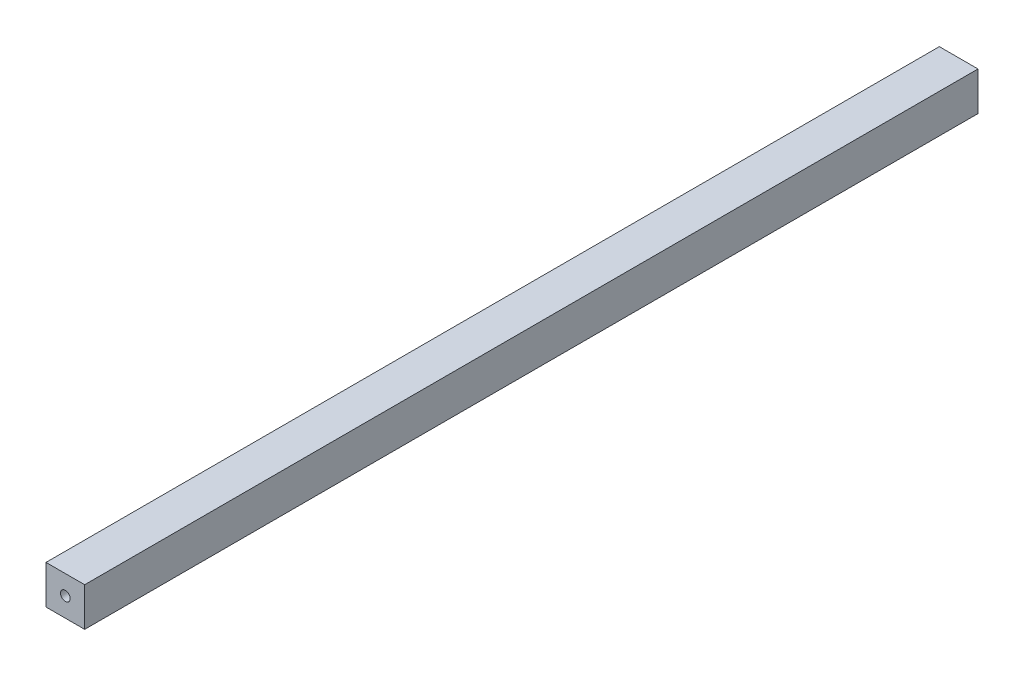
ISO-10303-21;
HEADER;
FILE_DESCRIPTION(('STEP AP214'),'2;1');
FILE_NAME('part.step','',(''),(''),'','','');
FILE_SCHEMA(('AUTOMOTIVE_DESIGN { 1 0 10303 214 1 1 1 1 }'));
ENDSEC;
DATA;
#1=APPLICATION_CONTEXT('core data for automotive mechanical design processes');
#2=APPLICATION_PROTOCOL_DEFINITION('international standard','automotive_design',2000,#1);
#3=PRODUCT_CONTEXT('',#1,'mechanical');
#4=PRODUCT('Part','Part','',(#3));
#5=PRODUCT_RELATED_PRODUCT_CATEGORY('part','',(#4));
#6=PRODUCT_DEFINITION_FORMATION('','',#4);
#7=PRODUCT_DEFINITION_CONTEXT('part definition',#1,'design');
#8=PRODUCT_DEFINITION('design','',#6,#7);
#9=PRODUCT_DEFINITION_SHAPE('','',#8);
#10=(LENGTH_UNIT() NAMED_UNIT(*) SI_UNIT(.MILLI.,.METRE.));
#11=(NAMED_UNIT(*) PLANE_ANGLE_UNIT() SI_UNIT($,.RADIAN.));
#12=(NAMED_UNIT(*) SI_UNIT($,.STERADIAN.) SOLID_ANGLE_UNIT());
#13=UNCERTAINTY_MEASURE_WITH_UNIT(LENGTH_MEASURE(1.E-05),#10,'distance_accuracy_value','');
#14=(GEOMETRIC_REPRESENTATION_CONTEXT(3) GLOBAL_UNCERTAINTY_ASSIGNED_CONTEXT((#13)) GLOBAL_UNIT_ASSIGNED_CONTEXT((#10,
#11,#12)) REPRESENTATION_CONTEXT('',''));
#15=CARTESIAN_POINT('',(0.,0.,0.));
#16=DIRECTION('',(0.,0.,1.));
#17=DIRECTION('',(1.,0.,0.));
#18=AXIS2_PLACEMENT_3D('',#15,#16,#17);
#19=CARTESIAN_POINT('',(-5.,5.,131.642135623731));
#20=DIRECTION('',(0.,-1.,0.));
#21=DIRECTION('',(0.,0.,-1.));
#22=AXIS2_PLACEMENT_3D('',#19,#20,#21);
#23=PLANE('',#22);
#24=DIRECTION('',(0.,0.,-1.));
#25=VECTOR('',#24,1.);
#26=CARTESIAN_POINT('',(-5.,5.,131.642135623731));
#27=LINE('',#26,#25);
#28=CARTESIAN_POINT('',(-5.,5.,115.5));
#29=VERTEX_POINT('',#28);
#30=CARTESIAN_POINT('',(-5.,5.,-115.5));
#31=VERTEX_POINT('',#30);
#32=EDGE_CURVE('E102',#29,#31,#27,.T.);
#33=ORIENTED_EDGE('',*,*,#32,.F.);
#34=DIRECTION('',(1.,0.,0.));
#35=VECTOR('',#34,1.);
#36=CARTESIAN_POINT('',(-5.,5.,115.5));
#37=LINE('',#36,#35);
#38=CARTESIAN_POINT('',(5.,5.,115.5));
#39=VERTEX_POINT('',#38);
#40=EDGE_CURVE('E43',#29,#39,#37,.T.);
#41=ORIENTED_EDGE('',*,*,#40,.T.);
#42=DIRECTION('',(0.,0.,-1.));
#43=VECTOR('',#42,1.);
#44=CARTESIAN_POINT('',(5.,5.,131.642135623731));
#45=LINE('',#44,#43);
#46=CARTESIAN_POINT('',(5.,5.,-115.5));
#47=VERTEX_POINT('',#46);
#48=EDGE_CURVE('E87',#39,#47,#45,.T.);
#49=ORIENTED_EDGE('',*,*,#48,.T.);
#50=DIRECTION('',(1.,0.,0.));
#51=VECTOR('',#50,1.);
#52=CARTESIAN_POINT('',(-5.,5.,-115.5));
#53=LINE('',#52,#51);
#54=EDGE_CURVE('E97',#31,#47,#53,.T.);
#55=ORIENTED_EDGE('',*,*,#54,.F.);
#56=EDGE_LOOP('',(#33,#41,#49,#55));
#57=FACE_BOUND('',#56,.T.);
#58=ADVANCED_FACE('F39',(#57),#23,.F.);
#59=CARTESIAN_POINT('',(5.,5.,131.642135623731));
#60=DIRECTION('',(-1.,0.,0.));
#61=DIRECTION('',(0.,-1.,0.));
#62=AXIS2_PLACEMENT_3D('',#59,#60,#61);
#63=PLANE('',#62);
#64=ORIENTED_EDGE('',*,*,#48,.F.);
#65=DIRECTION('',(0.,-1.,0.));
#66=VECTOR('',#65,1.);
#67=CARTESIAN_POINT('',(5.,5.,115.5));
#68=LINE('',#67,#66);
#69=CARTESIAN_POINT('',(5.,-5.,115.5));
#70=VERTEX_POINT('',#69);
#71=EDGE_CURVE('E83',#39,#70,#68,.T.);
#72=ORIENTED_EDGE('',*,*,#71,.T.);
#73=DIRECTION('',(0.,0.,-1.));
#74=VECTOR('',#73,1.);
#75=CARTESIAN_POINT('',(5.,-5.,131.642135623731));
#76=LINE('',#75,#74);
#77=CARTESIAN_POINT('',(5.,-5.,-115.5));
#78=VERTEX_POINT('',#77);
#79=EDGE_CURVE('E78',#70,#78,#76,.T.);
#80=ORIENTED_EDGE('',*,*,#79,.T.);
#81=DIRECTION('',(0.,-1.,0.));
#82=VECTOR('',#81,1.);
#83=CARTESIAN_POINT('',(5.,4.99999999999999,-115.5));
#84=LINE('',#83,#82);
#85=EDGE_CURVE('E82',#47,#78,#84,.T.);
#86=ORIENTED_EDGE('',*,*,#85,.F.);
#87=EDGE_LOOP('',(#64,#72,#80,#86));
#88=FACE_BOUND('',#87,.T.);
#89=ADVANCED_FACE('F81',(#88),#63,.F.);
#90=CARTESIAN_POINT('',(-5.,-5.,131.642135623731));
#91=DIRECTION('',(0.,1.,0.));
#92=DIRECTION('',(0.,0.,1.));
#93=AXIS2_PLACEMENT_3D('',#90,#91,#92);
#94=PLANE('',#93);
#95=ORIENTED_EDGE('',*,*,#79,.F.);
#96=DIRECTION('',(-1.,0.,0.));
#97=VECTOR('',#96,1.);
#98=CARTESIAN_POINT('',(-5.,-5.,115.5));
#99=LINE('',#98,#97);
#100=CARTESIAN_POINT('',(-5.,-5.,115.5));
#101=VERTEX_POINT('',#100);
#102=EDGE_CURVE('E48',#70,#101,#99,.T.);
#103=ORIENTED_EDGE('',*,*,#102,.T.);
#104=DIRECTION('',(0.,0.,-1.));
#105=VECTOR('',#104,1.);
#106=CARTESIAN_POINT('',(-5.,-5.,131.642135623731));
#107=LINE('',#106,#105);
#108=CARTESIAN_POINT('',(-5.,-5.,-115.5));
#109=VERTEX_POINT('',#108);
#110=EDGE_CURVE('E86',#101,#109,#107,.T.);
#111=ORIENTED_EDGE('',*,*,#110,.T.);
#112=DIRECTION('',(-1.,0.,0.));
#113=VECTOR('',#112,1.);
#114=CARTESIAN_POINT('',(-5.,-5.,-115.5));
#115=LINE('',#114,#113);
#116=EDGE_CURVE('E94',#78,#109,#115,.T.);
#117=ORIENTED_EDGE('',*,*,#116,.F.);
#118=EDGE_LOOP('',(#95,#103,#111,#117));
#119=FACE_BOUND('',#118,.T.);
#120=ADVANCED_FACE('F100',(#119),#94,.F.);
#121=CARTESIAN_POINT('',(-5.,5.,131.642135623731));
#122=DIRECTION('',(1.,0.,0.));
#123=DIRECTION('',(0.,1.,0.));
#124=AXIS2_PLACEMENT_3D('',#121,#122,#123);
#125=PLANE('',#124);
#126=ORIENTED_EDGE('',*,*,#110,.F.);
#127=DIRECTION('',(0.,1.,0.));
#128=VECTOR('',#127,1.);
#129=CARTESIAN_POINT('',(-5.,5.,115.5));
#130=LINE('',#129,#128);
#131=EDGE_CURVE('E12',#101,#29,#130,.T.);
#132=ORIENTED_EDGE('',*,*,#131,.T.);
#133=ORIENTED_EDGE('',*,*,#32,.T.);
#134=DIRECTION('',(0.,1.,0.));
#135=VECTOR('',#134,1.);
#136=CARTESIAN_POINT('',(-5.,4.99999999999999,-115.5));
#137=LINE('',#136,#135);
#138=EDGE_CURVE('E103',#109,#31,#137,.T.);
#139=ORIENTED_EDGE('',*,*,#138,.F.);
#140=EDGE_LOOP('',(#126,#132,#133,#139));
#141=FACE_BOUND('',#140,.T.);
#142=ADVANCED_FACE('F41',(#141),#125,.F.);
#143=CARTESIAN_POINT('',(-186.2,5.,115.5));
#144=DIRECTION('',(0.,0.,-1.));
#145=DIRECTION('',(0.,1.,0.));
#146=AXIS2_PLACEMENT_3D('',#143,#144,#145);
#147=PLANE('',#146);
#148=CARTESIAN_POINT('',(0.,0.,115.5));
#149=DIRECTION('',(0.,0.,1.));
#150=DIRECTION('',(1.,0.,0.));
#151=AXIS2_PLACEMENT_3D('',#148,#149,#150);
#152=CIRCLE('',#151,1.24999999999999);
#153=CARTESIAN_POINT('',(1.24999999999999,0.,115.5));
#154=VERTEX_POINT('',#153);
#155=EDGE_CURVE('E208',#154,#154,#152,.T.);
#156=ORIENTED_EDGE('',*,*,#155,.F.);
#157=EDGE_LOOP('',(#156));
#158=FACE_BOUND('',#157,.T.);
#159=ORIENTED_EDGE('',*,*,#102,.F.);
#160=ORIENTED_EDGE('',*,*,#71,.F.);
#161=ORIENTED_EDGE('',*,*,#40,.F.);
#162=ORIENTED_EDGE('',*,*,#131,.F.);
#163=EDGE_LOOP('',(#159,#160,#161,#162));
#164=FACE_BOUND('',#163,.T.);
#165=ADVANCED_FACE('F114',(#158,#164),#147,.F.);
#166=CARTESIAN_POINT('',(-186.2,-5.,-115.5));
#167=DIRECTION('',(0.,0.,1.));
#168=DIRECTION('',(0.,-1.,0.));
#169=AXIS2_PLACEMENT_3D('',#166,#167,#168);
#170=PLANE('',#169);
#171=CARTESIAN_POINT('',(0.,0.,-115.5));
#172=DIRECTION('',(0.,0.,-1.));
#173=DIRECTION('',(0.,1.,0.));
#174=AXIS2_PLACEMENT_3D('',#171,#172,#173);
#175=CIRCLE('',#174,1.24999999999999);
#176=CARTESIAN_POINT('',(0.,1.25000000000003,-115.5));
#177=VERTEX_POINT('',#176);
#178=EDGE_CURVE('E206',#177,#177,#175,.T.);
#179=ORIENTED_EDGE('',*,*,#178,.F.);
#180=EDGE_LOOP('',(#179));
#181=FACE_BOUND('',#180,.T.);
#182=ORIENTED_EDGE('',*,*,#138,.T.);
#183=ORIENTED_EDGE('',*,*,#54,.T.);
#184=ORIENTED_EDGE('',*,*,#85,.T.);
#185=ORIENTED_EDGE('',*,*,#116,.T.);
#186=EDGE_LOOP('',(#182,#183,#184,#185));
#187=FACE_BOUND('',#186,.T.);
#188=ADVANCED_FACE('F93',(#181,#187),#170,.F.);
#189=CARTESIAN_POINT('',(0.,0.,107.));
#190=DIRECTION('',(0.,0.,-1.));
#191=DIRECTION('',(-1.,0.,0.));
#192=AXIS2_PLACEMENT_3D('',#189,#190,#191);
#193=PLANE('',#192);
#194=CARTESIAN_POINT('',(0.,0.,107.));
#195=DIRECTION('',(0.,0.,1.));
#196=DIRECTION('',(1.,0.,0.));
#197=AXIS2_PLACEMENT_3D('',#194,#195,#196);
#198=CIRCLE('',#197,1.24999999999999);
#199=CARTESIAN_POINT('',(1.24999999999999,0.,107.));
#200=VERTEX_POINT('',#199);
#201=EDGE_CURVE('E98',#200,#200,#198,.T.);
#202=ORIENTED_EDGE('',*,*,#201,.T.);
#203=EDGE_LOOP('',(#202));
#204=FACE_BOUND('',#203,.T.);
#205=ADVANCED_FACE('F123',(#204),#193,.F.);
#206=CARTESIAN_POINT('',(0.,0.,115.5));
#207=DIRECTION('',(0.,0.,1.));
#208=DIRECTION('',(1.,0.,0.));
#209=AXIS2_PLACEMENT_3D('',#206,#207,#208);
#210=CYLINDRICAL_SURFACE('',#209,1.24999999999999);
#211=ORIENTED_EDGE('',*,*,#201,.F.);
#212=EDGE_LOOP('',(#211));
#213=FACE_BOUND('',#212,.T.);
#214=ORIENTED_EDGE('',*,*,#155,.T.);
#215=EDGE_LOOP('',(#214));
#216=FACE_BOUND('',#215,.T.);
#217=ADVANCED_FACE('F160',(#213,#216),#210,.F.);
#218=CARTESIAN_POINT('',(0.,0.,-107.));
#219=DIRECTION('',(0.,0.,1.));
#220=DIRECTION('',(0.,-1.,0.));
#221=AXIS2_PLACEMENT_3D('',#218,#219,#220);
#222=PLANE('',#221);
#223=CARTESIAN_POINT('',(0.,0.,-107.));
#224=DIRECTION('',(0.,0.,-1.));
#225=DIRECTION('',(0.,1.,0.));
#226=AXIS2_PLACEMENT_3D('',#223,#224,#225);
#227=CIRCLE('',#226,1.24999999999999);
#228=CARTESIAN_POINT('',(0.,1.25000000000003,-107.));
#229=VERTEX_POINT('',#228);
#230=EDGE_CURVE('E203',#229,#229,#227,.T.);
#231=ORIENTED_EDGE('',*,*,#230,.T.);
#232=EDGE_LOOP('',(#231));
#233=FACE_BOUND('',#232,.T.);
#234=ADVANCED_FACE('F167',(#233),#222,.F.);
#235=CARTESIAN_POINT('',(0.,0.,-115.5));
#236=DIRECTION('',(0.,0.,-1.));
#237=DIRECTION('',(0.,1.,0.));
#238=AXIS2_PLACEMENT_3D('',#235,#236,#237);
#239=CYLINDRICAL_SURFACE('',#238,1.24999999999999);
#240=ORIENTED_EDGE('',*,*,#230,.F.);
#241=EDGE_LOOP('',(#240));
#242=FACE_BOUND('',#241,.T.);
#243=ORIENTED_EDGE('',*,*,#178,.T.);
#244=EDGE_LOOP('',(#243));
#245=FACE_BOUND('',#244,.T.);
#246=ADVANCED_FACE('F175',(#242,#245),#239,.F.);
#247=CLOSED_SHELL('',(#58,#89,#120,#142,#165,#188,#205,#217,#234,#246));
#248=MANIFOLD_SOLID_BREP('B2',#247);
#249=ADVANCED_BREP_SHAPE_REPRESENTATION('',(#18,#248),#14);
#250=SHAPE_DEFINITION_REPRESENTATION(#9,#249);
ENDSEC;
END-ISO-10303-21;
